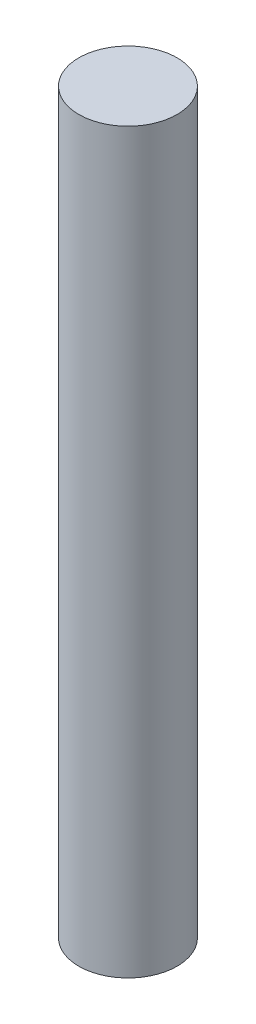
ISO-10303-21;
HEADER;
FILE_DESCRIPTION(('STEP AP214'),'2;1');
FILE_NAME('part.step','',(''),(''),'','','');
FILE_SCHEMA(('AUTOMOTIVE_DESIGN { 1 0 10303 214 1 1 1 1 }'));
ENDSEC;
DATA;
#1=APPLICATION_CONTEXT('core data for automotive mechanical design processes');
#2=APPLICATION_PROTOCOL_DEFINITION('international standard','automotive_design',2000,#1);
#3=PRODUCT_CONTEXT('',#1,'mechanical');
#4=PRODUCT('Part','Part','',(#3));
#5=PRODUCT_RELATED_PRODUCT_CATEGORY('part','',(#4));
#6=PRODUCT_DEFINITION_FORMATION('','',#4);
#7=PRODUCT_DEFINITION_CONTEXT('part definition',#1,'design');
#8=PRODUCT_DEFINITION('design','',#6,#7);
#9=PRODUCT_DEFINITION_SHAPE('','',#8);
#10=(LENGTH_UNIT() NAMED_UNIT(*) SI_UNIT(.MILLI.,.METRE.));
#11=(NAMED_UNIT(*) PLANE_ANGLE_UNIT() SI_UNIT($,.RADIAN.));
#12=(NAMED_UNIT(*) SI_UNIT($,.STERADIAN.) SOLID_ANGLE_UNIT());
#13=UNCERTAINTY_MEASURE_WITH_UNIT(LENGTH_MEASURE(1.E-05),#10,'distance_accuracy_value','');
#14=(GEOMETRIC_REPRESENTATION_CONTEXT(3) GLOBAL_UNCERTAINTY_ASSIGNED_CONTEXT((#13)) GLOBAL_UNIT_ASSIGNED_CONTEXT((#10,
#11,#12)) REPRESENTATION_CONTEXT('',''));
#15=CARTESIAN_POINT('',(0.,0.,0.));
#16=DIRECTION('',(0.,0.,1.));
#17=DIRECTION('',(1.,0.,0.));
#18=AXIS2_PLACEMENT_3D('',#15,#16,#17);
#19=CARTESIAN_POINT('',(0.,-10.,0.));
#20=DIRECTION('',(0.,1.,0.));
#21=DIRECTION('',(0.,0.,1.));
#22=AXIS2_PLACEMENT_3D('',#19,#20,#21);
#23=CYLINDRICAL_SURFACE('',#22,5.);
#24=CARTESIAN_POINT('',(0.,-10.,0.));
#25=DIRECTION('',(0.,1.,0.));
#26=DIRECTION('',(0.,0.,1.));
#27=AXIS2_PLACEMENT_3D('',#24,#25,#26);
#28=CIRCLE('',#27,5.);
#29=CARTESIAN_POINT('',(0.,-10.,5.));
#30=VERTEX_POINT('',#29);
#31=EDGE_CURVE('E10',#30,#30,#28,.T.);
#32=ORIENTED_EDGE('',*,*,#31,.T.);
#33=EDGE_LOOP('',(#32));
#34=FACE_BOUND('',#33,.T.);
#35=CARTESIAN_POINT('',(0.,65.0555569972273,0.));
#36=DIRECTION('',(0.,1.,0.));
#37=DIRECTION('',(0.,0.,1.));
#38=AXIS2_PLACEMENT_3D('',#35,#36,#37);
#39=CIRCLE('',#38,5.);
#40=CARTESIAN_POINT('',(0.,65.0555569972273,5.));
#41=VERTEX_POINT('',#40);
#42=EDGE_CURVE('E37',#41,#41,#39,.T.);
#43=ORIENTED_EDGE('',*,*,#42,.F.);
#44=EDGE_LOOP('',(#43));
#45=FACE_BOUND('',#44,.T.);
#46=ADVANCED_FACE('F31',(#34,#45),#23,.T.);
#47=CARTESIAN_POINT('',(0.,-10.,0.));
#48=DIRECTION('',(0.,1.,0.));
#49=DIRECTION('',(0.,0.,1.));
#50=AXIS2_PLACEMENT_3D('',#47,#48,#49);
#51=PLANE('',#50);
#52=ORIENTED_EDGE('',*,*,#31,.F.);
#53=EDGE_LOOP('',(#52));
#54=FACE_BOUND('',#53,.T.);
#55=ADVANCED_FACE('F46',(#54),#51,.F.);
#56=CARTESIAN_POINT('',(0.,65.0555569972273,0.));
#57=DIRECTION('',(0.,1.,0.));
#58=DIRECTION('',(0.,0.,1.));
#59=AXIS2_PLACEMENT_3D('',#56,#57,#58);
#60=PLANE('',#59);
#61=ORIENTED_EDGE('',*,*,#42,.T.);
#62=EDGE_LOOP('',(#61));
#63=FACE_BOUND('',#62,.T.);
#64=ADVANCED_FACE('F43',(#63),#60,.T.);
#65=CLOSED_SHELL('',(#46,#55,#64));
#66=MANIFOLD_SOLID_BREP('B2',#65);
#67=ADVANCED_BREP_SHAPE_REPRESENTATION('',(#18,#66),#14);
#68=SHAPE_DEFINITION_REPRESENTATION(#9,#67);
ENDSEC;
END-ISO-10303-21;
